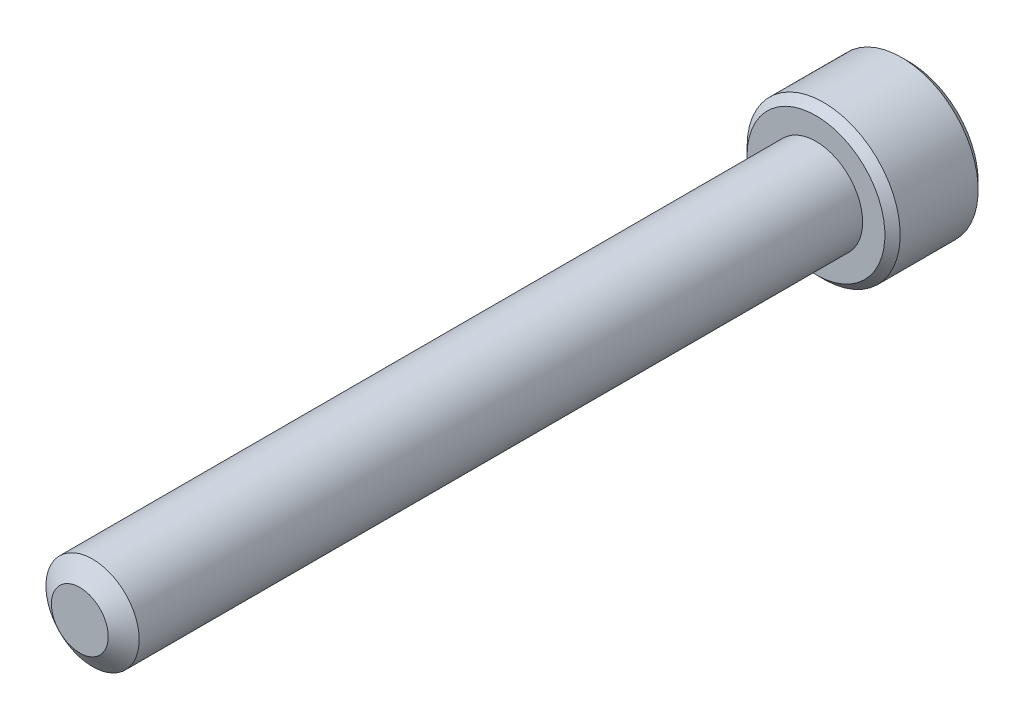
ISO-10303-21;
HEADER;
FILE_DESCRIPTION(('STEP AP214'),'2;1');
FILE_NAME('part.step','',(''),(''),'','','');
FILE_SCHEMA(('AUTOMOTIVE_DESIGN { 1 0 10303 214 1 1 1 1 }'));
ENDSEC;
DATA;
#1=APPLICATION_CONTEXT('core data for automotive mechanical design processes');
#2=APPLICATION_PROTOCOL_DEFINITION('international standard','automotive_design',2000,#1);
#3=PRODUCT_CONTEXT('',#1,'mechanical');
#4=PRODUCT('Part','Part','',(#3));
#5=PRODUCT_RELATED_PRODUCT_CATEGORY('part','',(#4));
#6=PRODUCT_DEFINITION_FORMATION('','',#4);
#7=PRODUCT_DEFINITION_CONTEXT('part definition',#1,'design');
#8=PRODUCT_DEFINITION('design','',#6,#7);
#9=PRODUCT_DEFINITION_SHAPE('','',#8);
#10=(LENGTH_UNIT() NAMED_UNIT(*) SI_UNIT(.MILLI.,.METRE.));
#11=(NAMED_UNIT(*) PLANE_ANGLE_UNIT() SI_UNIT($,.RADIAN.));
#12=(NAMED_UNIT(*) SI_UNIT($,.STERADIAN.) SOLID_ANGLE_UNIT());
#13=UNCERTAINTY_MEASURE_WITH_UNIT(LENGTH_MEASURE(1.E-05),#10,'distance_accuracy_value','');
#14=(GEOMETRIC_REPRESENTATION_CONTEXT(3) GLOBAL_UNCERTAINTY_ASSIGNED_CONTEXT((#13)) GLOBAL_UNIT_ASSIGNED_CONTEXT((#10,
#11,#12)) REPRESENTATION_CONTEXT('',''));
#15=CARTESIAN_POINT('',(0.,0.,0.));
#16=DIRECTION('',(0.,0.,1.));
#17=DIRECTION('',(1.,0.,0.));
#18=AXIS2_PLACEMENT_3D('',#15,#16,#17);
#19=CARTESIAN_POINT('',(0.,0.,-38.1));
#20=DIRECTION('',(0.,0.,1.));
#21=DIRECTION('',(1.,0.,0.));
#22=AXIS2_PLACEMENT_3D('',#19,#20,#21);
#23=CYLINDRICAL_SURFACE('',#22,2.413);
#24=CARTESIAN_POINT('',(0.,0.,-38.1));
#25=DIRECTION('',(0.,0.,-1.));
#26=DIRECTION('',(-1.,0.,0.));
#27=AXIS2_PLACEMENT_3D('',#24,#25,#26);
#28=CIRCLE('',#27,2.413);
#29=CARTESIAN_POINT('',(2.413,0.,-38.1));
#30=VERTEX_POINT('',#29);
#31=EDGE_CURVE('E216',#30,#30,#28,.F.);
#32=CARTESIAN_POINT('',(0.,0.,-0.659180743038974));
#33=DIRECTION('',(0.,0.,1.));
#34=DIRECTION('',(1.,0.,0.));
#35=AXIS2_PLACEMENT_3D('',#32,#33,#34);
#36=CIRCLE('',#35,2.413);
#37=CARTESIAN_POINT('',(2.413,0.,-0.659180743038973));
#38=VERTEX_POINT('',#37);
#39=EDGE_CURVE('E110',#38,#38,#36,.T.);
#40=CARTESIAN_POINT('',(2.413,0.,-38.1));
#41=CARTESIAN_POINT('',(2.413,0.,-37.7099914660733));
#42=CARTESIAN_POINT('',(2.413,0.,-37.3199829321466));
#43=CARTESIAN_POINT('',(2.413,0.,-36.5399658642933));
#44=CARTESIAN_POINT('',(2.413,0.,-36.1499573303666));
#45=CARTESIAN_POINT('',(2.413,0.,-35.3699402625133));
#46=CARTESIAN_POINT('',(2.413,0.,-34.9799317285866));
#47=CARTESIAN_POINT('',(2.413,0.,-34.1999146607332));
#48=CARTESIAN_POINT('',(2.413,0.,-33.8099061268066));
#49=CARTESIAN_POINT('',(2.413,0.,-33.0298890589532));
#50=CARTESIAN_POINT('',(2.413,0.,-32.6398805250265));
#51=CARTESIAN_POINT('',(2.413,0.,-31.8598634571732));
#52=CARTESIAN_POINT('',(2.413,0.,-31.4698549232465));
#53=CARTESIAN_POINT('',(2.413,0.,-30.6898378553931));
#54=CARTESIAN_POINT('',(2.413,0.,-30.2998293214665));
#55=CARTESIAN_POINT('',(2.413,0.,-29.5198122536131));
#56=CARTESIAN_POINT('',(2.413,0.,-29.1298037196864));
#57=CARTESIAN_POINT('',(2.413,0.,-28.3497866518331));
#58=CARTESIAN_POINT('',(2.413,0.,-27.9597781179064));
#59=CARTESIAN_POINT('',(2.413,0.,-27.179761050053));
#60=CARTESIAN_POINT('',(2.413,0.,-26.7897525161264));
#61=CARTESIAN_POINT('',(2.413,0.,-26.009735448273));
#62=CARTESIAN_POINT('',(2.413,0.,-25.6197269143463));
#63=CARTESIAN_POINT('',(2.413,0.,-24.839709846493));
#64=CARTESIAN_POINT('',(2.413,0.,-24.4497013125663));
#65=CARTESIAN_POINT('',(2.413,0.,-23.6696842447129));
#66=CARTESIAN_POINT('',(2.413,0.,-23.2796757107863));
#67=CARTESIAN_POINT('',(2.413,0.,-22.4996586429329));
#68=CARTESIAN_POINT('',(2.413,0.,-22.1096501090062));
#69=CARTESIAN_POINT('',(2.413,0.,-21.3296330411529));
#70=CARTESIAN_POINT('',(2.413,0.,-20.9396245072262));
#71=CARTESIAN_POINT('',(2.413,0.,-20.1596074393728));
#72=CARTESIAN_POINT('',(2.413,0.,-19.7695989054462));
#73=CARTESIAN_POINT('',(2.413,0.,-18.9895818375928));
#74=CARTESIAN_POINT('',(2.413,0.,-18.5995733036661));
#75=CARTESIAN_POINT('',(2.413,0.,-17.8195562358128));
#76=CARTESIAN_POINT('',(2.413,0.,-17.4295477018861));
#77=CARTESIAN_POINT('',(2.413,0.,-16.6495306340327));
#78=CARTESIAN_POINT('',(2.413,0.,-16.2595221001061));
#79=CARTESIAN_POINT('',(2.413,0.,-15.4795050322527));
#80=CARTESIAN_POINT('',(2.413,0.,-15.089496498326));
#81=CARTESIAN_POINT('',(2.413,0.,-14.3094794304727));
#82=CARTESIAN_POINT('',(2.413,0.,-13.919470896546));
#83=CARTESIAN_POINT('',(2.413,0.,-13.1394538286927));
#84=CARTESIAN_POINT('',(2.413,0.,-12.749445294766));
#85=CARTESIAN_POINT('',(2.413,0.,-11.9694282269126));
#86=CARTESIAN_POINT('',(2.413,0.,-11.5794196929859));
#87=CARTESIAN_POINT('',(2.413,0.,-10.7994026251326));
#88=CARTESIAN_POINT('',(2.413,0.,-10.4093940912059));
#89=CARTESIAN_POINT('',(2.413,0.,-9.62937702335255));
#90=CARTESIAN_POINT('',(2.413,0.,-9.23936848942587));
#91=CARTESIAN_POINT('',(2.413,0.,-8.45935142157252));
#92=CARTESIAN_POINT('',(2.413,0.,-8.06934288764584));
#93=CARTESIAN_POINT('',(2.413,0.,-7.28932581979249));
#94=CARTESIAN_POINT('',(2.413,0.,-6.89931728586581));
#95=CARTESIAN_POINT('',(2.413,0.,-6.11930021801246));
#96=CARTESIAN_POINT('',(2.413,0.,-5.72929168408578));
#97=CARTESIAN_POINT('',(2.413,0.,-4.94927461623242));
#98=CARTESIAN_POINT('',(2.413,0.,-4.55926608230574));
#99=CARTESIAN_POINT('',(2.413,0.,-3.77924901445239));
#100=CARTESIAN_POINT('',(2.413,0.,-3.38924048052572));
#101=CARTESIAN_POINT('',(2.413,0.,-2.60922341267236));
#102=CARTESIAN_POINT('',(2.413,0.,-2.21921487874568));
#103=CARTESIAN_POINT('',(2.413,0.,-1.43919781089233));
#104=CARTESIAN_POINT('',(2.413,0.,-1.04918927696565));
#105=CARTESIAN_POINT('',(2.413,0.,-0.659180743038973));
#106=B_SPLINE_CURVE_WITH_KNOTS('',3,(#40,#41,#42,#43,#44,#45,#46,#47,#48,#49,#50,#51,#52,#53,
#54,#55,#56,#57,#58,#59,#60,#61,#62,#63,#64,#65,#66,#67,#68,#69,#70,#71,#72,#73,#74,#75,#76,#77,
#78,#79,#80,#81,#82,#83,#84,#85,#86,#87,#88,#89,#90,#91,#92,#93,#94,#95,#96,#97,#98,#99,#100,
#101,#102,#103,#104,#105),.UNSPECIFIED.,.F.,.F.,(4,2,2,2,2,2,2,2,2,2,2,2,2,2,2,2,2,2,2,2,2,2,2,
2,2,2,2,2,2,2,2,2,4),(0.,1.17002560178003,2.34005120356006,3.51007680534009,4.68010240712012,
5.85012800890015,7.02015361068019,8.19017921246022,9.36020481424025,10.5302304160203,
11.7002560178003,12.8702816195803,14.0403072213604,15.2103328231404,16.3803584249204,
17.5503840267005,18.7204096284805,19.8904352302605,21.0604608320406,22.2304864338206,
23.4005120356006,24.5705376373807,25.7405632391607,26.9105888409407,28.0806144427208,
29.2506400445008,30.4206656462808,31.5906912480609,32.7607168498409,33.9307424516209,
35.100768053401,36.270793655181,37.440819256961),.UNSPECIFIED.);
#107=EDGE_CURVE('BSEAM36',#30,#38,#106,.T.);
#108=ORIENTED_EDGE('',*,*,#31,.T.);
#109=ORIENTED_EDGE('',*,*,#39,.F.);
#110=ORIENTED_EDGE('',*,*,#107,.T.);
#111=ORIENTED_EDGE('',*,*,#107,.F.);
#112=EDGE_LOOP('',(#108,#110,#109,#111));
#113=FACE_BOUND('',#112,.T.);
#114=ADVANCED_FACE('F36',(#113),#23,.T.);
#115=CARTESIAN_POINT('',(0.,0.,0.));
#116=DIRECTION('',(0.,0.,-1.));
#117=DIRECTION('',(-1.,0.,0.));
#118=AXIS2_PLACEMENT_3D('',#115,#116,#117);
#119=CONICAL_SURFACE('',#118,1.4715923357461,0.959931088596884);
#120=ORIENTED_EDGE('',*,*,#39,.T.);
#121=EDGE_LOOP('',(#120));
#122=FACE_BOUND('',#121,.T.);
#123=CARTESIAN_POINT('',(0.,0.,0.));
#124=DIRECTION('',(0.,0.,1.));
#125=DIRECTION('',(1.,0.,0.));
#126=AXIS2_PLACEMENT_3D('',#123,#124,#125);
#127=CIRCLE('',#126,1.4715923357461);
#128=CARTESIAN_POINT('',(1.4715923357461,0.,0.));
#129=VERTEX_POINT('',#128);
#130=EDGE_CURVE('E214',#129,#129,#127,.T.);
#131=ORIENTED_EDGE('',*,*,#130,.F.);
#132=EDGE_LOOP('',(#131));
#133=FACE_BOUND('',#132,.T.);
#134=ADVANCED_FACE('F197',(#122,#133),#119,.T.);
#135=CARTESIAN_POINT('',(0.,0.,0.));
#136=DIRECTION('',(0.,0.,1.));
#137=DIRECTION('',(1.,0.,0.));
#138=AXIS2_PLACEMENT_3D('',#135,#136,#137);
#139=PLANE('',#138);
#140=ORIENTED_EDGE('',*,*,#130,.T.);
#141=EDGE_LOOP('',(#140));
#142=FACE_BOUND('',#141,.T.);
#143=ADVANCED_FACE('F194',(#142),#139,.T.);
#144=CARTESIAN_POINT('',(0.,0.,-42.926));
#145=DIRECTION('',(0.,0.,1.));
#146=DIRECTION('',(1.,0.,0.));
#147=AXIS2_PLACEMENT_3D('',#144,#145,#146);
#148=CYLINDRICAL_SURFACE('',#147,3.9624);
#149=CARTESIAN_POINT('',(0.,0.,-42.52976));
#150=DIRECTION('',(0.,0.,-1.));
#151=DIRECTION('',(-1.,0.,0.));
#152=AXIS2_PLACEMENT_3D('',#149,#150,#151);
#153=CIRCLE('',#152,3.9624);
#154=CARTESIAN_POINT('',(-3.9624,0.,-42.52976));
#155=VERTEX_POINT('',#154);
#156=EDGE_CURVE('E44',#155,#155,#153,.F.);
#157=ORIENTED_EDGE('',*,*,#156,.T.);
#158=EDGE_LOOP('',(#157));
#159=FACE_BOUND('',#158,.T.);
#160=CARTESIAN_POINT('',(0.,0.,-38.49624));
#161=DIRECTION('',(0.,0.,-1.));
#162=DIRECTION('',(-1.,0.,0.));
#163=AXIS2_PLACEMENT_3D('',#160,#161,#162);
#164=CIRCLE('',#163,3.9624);
#165=CARTESIAN_POINT('',(-3.9624,0.,-38.49624));
#166=VERTEX_POINT('',#165);
#167=EDGE_CURVE('E173',#166,#166,#164,.T.);
#168=ORIENTED_EDGE('',*,*,#167,.T.);
#169=EDGE_LOOP('',(#168));
#170=FACE_BOUND('',#169,.T.);
#171=ADVANCED_FACE('F178',(#159,#170),#148,.T.);
#172=CARTESIAN_POINT('',(0.,0.,-42.926));
#173=DIRECTION('',(0.,0.,-1.));
#174=DIRECTION('',(-1.,0.,0.));
#175=AXIS2_PLACEMENT_3D('',#172,#173,#174);
#176=PLANE('',#175);
#177=CARTESIAN_POINT('',(0.,0.,-42.926));
#178=DIRECTION('',(0.,0.,-1.));
#179=DIRECTION('',(-1.,0.,0.));
#180=AXIS2_PLACEMENT_3D('',#177,#178,#179);
#181=CIRCLE('',#180,3.56616000000001);
#182=CARTESIAN_POINT('',(-3.56616000000001,0.,-42.926));
#183=VERTEX_POINT('',#182);
#184=EDGE_CURVE('E109',#183,#183,#181,.T.);
#185=ORIENTED_EDGE('',*,*,#184,.T.);
#186=EDGE_LOOP('',(#185));
#187=FACE_BOUND('',#186,.T.);
#188=CARTESIAN_POINT('',(0.,0.,-42.926));
#189=DIRECTION('',(0.,0.,-1.));
#190=DIRECTION('',(-1.,0.,0.));
#191=AXIS2_PLACEMENT_3D('',#188,#189,#190);
#192=CIRCLE('',#191,2.29135888084633);
#193=CARTESIAN_POINT('',(-1.984375,1.14567944042316,-42.926));
#194=VERTEX_POINT('',#193);
#195=CARTESIAN_POINT('',(0.,2.29135888084633,-42.926));
#196=VERTEX_POINT('',#195);
#197=EDGE_CURVE('E90',#194,#196,#192,.T.);
#198=ORIENTED_EDGE('',*,*,#197,.F.);
#199=CARTESIAN_POINT('',(-1.984375,-1.14567944042316,-42.926));
#200=VERTEX_POINT('',#199);
#201=EDGE_CURVE('E50',#200,#194,#192,.T.);
#202=ORIENTED_EDGE('',*,*,#201,.F.);
#203=CARTESIAN_POINT('',(0.,-2.29135888084633,-42.926));
#204=VERTEX_POINT('',#203);
#205=EDGE_CURVE('E275',#204,#200,#192,.T.);
#206=ORIENTED_EDGE('',*,*,#205,.F.);
#207=CARTESIAN_POINT('',(1.984375,-1.14567944042316,-42.926));
#208=VERTEX_POINT('',#207);
#209=EDGE_CURVE('E57',#208,#204,#192,.T.);
#210=ORIENTED_EDGE('',*,*,#209,.F.);
#211=CARTESIAN_POINT('',(1.984375,1.14567944042316,-42.926));
#212=VERTEX_POINT('',#211);
#213=EDGE_CURVE('E131',#212,#208,#192,.T.);
#214=ORIENTED_EDGE('',*,*,#213,.F.);
#215=EDGE_CURVE('E99',#196,#212,#192,.T.);
#216=ORIENTED_EDGE('',*,*,#215,.F.);
#217=EDGE_LOOP('',(#198,#202,#206,#210,#214,#216));
#218=FACE_BOUND('',#217,.T.);
#219=ADVANCED_FACE('F130',(#187,#218),#176,.T.);
#220=CARTESIAN_POINT('',(0.,0.,-38.1));
#221=DIRECTION('',(0.,0.,-1.));
#222=DIRECTION('',(-1.,0.,0.));
#223=AXIS2_PLACEMENT_3D('',#220,#221,#222);
#224=PLANE('',#223);
#225=CARTESIAN_POINT('',(0.,0.,-38.1));
#226=DIRECTION('',(0.,0.,-1.));
#227=DIRECTION('',(-1.,0.,0.));
#228=AXIS2_PLACEMENT_3D('',#225,#226,#227);
#229=CIRCLE('',#228,3.56616);
#230=CARTESIAN_POINT('',(-3.56616,0.,-38.1));
#231=VERTEX_POINT('',#230);
#232=EDGE_CURVE('E11',#231,#231,#229,.F.);
#233=ORIENTED_EDGE('',*,*,#232,.T.);
#234=EDGE_LOOP('',(#233));
#235=FACE_BOUND('',#234,.T.);
#236=ORIENTED_EDGE('',*,*,#31,.F.);
#237=EDGE_LOOP('',(#236));
#238=FACE_BOUND('',#237,.T.);
#239=ADVANCED_FACE('F187',(#235,#238),#224,.F.);
#240=CARTESIAN_POINT('',(0.,0.,-42.926));
#241=DIRECTION('',(0.,0.,-1.));
#242=DIRECTION('',(-1.,0.,0.));
#243=AXIS2_PLACEMENT_3D('',#240,#241,#242);
#244=CONICAL_SURFACE('',#243,2.29135888084633,0.78539816339745);
#245=ORIENTED_EDGE('',*,*,#215,.T.);
#246=CARTESIAN_POINT('',(-0.000199999999999152,2.29147435090016,-42.9261154787818));
#247=CARTESIAN_POINT('',(0.0680159951668034,2.25208982772757,-42.8867628522639));
#248=CARTESIAN_POINT('',(0.137372685106968,2.21204672412052,-42.8497213104462));
#249=CARTESIAN_POINT('',(0.27879880045219,2.13039431835551,-42.7818988584233));
#250=CARTESIAN_POINT('',(0.350881678736784,2.08877724917394,-42.7511556890917));
#251=CARTESIAN_POINT('',(0.496233397266005,2.00485839535392,-42.6984918888112));
#252=CARTESIAN_POINT('',(0.56946521248694,1.96257798712286,-42.67643887588));
#253=CARTESIAN_POINT('',(0.717541182594709,1.87708628592063,-42.6424614929439));
#254=CARTESIAN_POINT('',(0.792380812753429,1.83387760530244,-42.6305117560917));
#255=CARTESIAN_POINT('',(0.921360414543821,1.75941119748879,-42.6197300990819));
#256=CARTESIAN_POINT('',(0.975333715772448,1.72824969749539,-42.6181338990591));
#257=CARTESIAN_POINT('',(1.08319211851981,1.66597761963484,-42.6208218388653));
#258=CARTESIAN_POINT('',(1.13707718248553,1.63486706344893,-42.6251080403405));
#259=CARTESIAN_POINT('',(1.24433853824861,1.57293969082547,-42.6393168730135));
#260=CARTESIAN_POINT('',(1.29771419276015,1.54212324232506,-42.6492458104523));
#261=CARTESIAN_POINT('',(1.4035425174089,1.48102323060121,-42.6741950842745));
#262=CARTESIAN_POINT('',(1.45599525797111,1.45073962671789,-42.6892150303895));
#263=CARTESIAN_POINT('',(1.59035733896365,1.37316564308797,-42.7338078516357));
#264=CARTESIAN_POINT('',(1.67143335715833,1.32635638215845,-42.7667429959383));
#265=CARTESIAN_POINT('',(1.79064830672984,1.25752759893191,-42.8223424412022));
#266=CARTESIAN_POINT('',(1.829934924386,1.23484545965257,-42.8418775920519));
#267=CARTESIAN_POINT('',(1.90778036186805,1.18990137536713,-42.8827287381194));
#268=CARTESIAN_POINT('',(1.9463396111017,1.16763918244233,-42.9040436395683));
#269=CARTESIAN_POINT('',(1.984575,1.14556397036933,-42.9261154787818));
#270=B_SPLINE_CURVE_WITH_KNOTS('',3,(#246,#247,#248,#249,#250,#251,#252,#253,#254,#255,#256,
#257,#258,#259,#260,#261,#262,#263,#264,#265,#266,#267,#268,#269),.UNSPECIFIED.,.F.,.F.,(4,2,2,
2,2,2,2,2,2,2,2,4),(0.,0.264339630306631,0.530219665093695,0.791876416371461,1.0528742441811,
1.23963984393201,1.42647091743853,1.61351120244035,1.80053715247541,2.09764209964316,
2.24579179873713,2.39385111134157),.UNSPECIFIED.);
#271=EDGE_CURVE('E104',#196,#212,#270,.T.);
#272=ORIENTED_EDGE('',*,*,#271,.F.);
#273=EDGE_LOOP('',(#245,#272));
#274=FACE_BOUND('',#273,.T.);
#275=ADVANCED_FACE('F105',(#274),#244,.F.);
#276=ORIENTED_EDGE('',*,*,#213,.T.);
#277=CARTESIAN_POINT('',(1.984375,-2.28495242157822,-43.6609840788166));
#278=CARTESIAN_POINT('',(1.984375,-2.22931635455401,-43.6189866855508));
#279=CARTESIAN_POINT('',(1.984375,-2.17336876548388,-43.5773960540763));
#280=CARTESIAN_POINT('',(1.984375,-2.0607277025817,-43.4952084614715));
#281=CARTESIAN_POINT('',(1.984375,-2.00403404503434,-43.454611752405));
#282=CARTESIAN_POINT('',(1.984375,-1.88936329173488,-43.3743035031747));
#283=CARTESIAN_POINT('',(1.984375,-1.83137965519347,-43.3346012588133));
#284=CARTESIAN_POINT('',(1.984375,-1.7144280213784,-43.2566851734013));
#285=CARTESIAN_POINT('',(1.984375,-1.65546009407227,-43.2184712271944));
#286=CARTESIAN_POINT('',(1.984375,-1.47005472306035,-43.1022528340136));
#287=CARTESIAN_POINT('',(1.984375,-1.34163909427883,-43.0273478868724));
#288=CARTESIAN_POINT('',(1.984375,-1.07840384705479,-42.8903302154397));
#289=CARTESIAN_POINT('',(1.984375,-0.94360778140742,-42.8281743664824));
#290=CARTESIAN_POINT('',(1.984375,-0.741275100444877,-42.7521325786886));
#291=CARTESIAN_POINT('',(1.984375,-0.67673540888109,-42.730308061326));
#292=CARTESIAN_POINT('',(1.984375,-0.546098118112757,-42.6918404635378));
#293=CARTESIAN_POINT('',(1.984375,-0.480000411919951,-42.6751977400655));
#294=CARTESIAN_POINT('',(1.984375,-0.347746170028527,-42.6482353808697));
#295=CARTESIAN_POINT('',(1.984375,-0.281612071479118,-42.6378074097359));
#296=CARTESIAN_POINT('',(1.984375,-0.148636620052344,-42.6234781473766));
#297=CARTESIAN_POINT('',(1.984375,-0.0817953907393173,-42.6195757342274));
#298=CARTESIAN_POINT('',(1.984375,0.0495156750890711,-42.6185870513327));
#299=CARTESIAN_POINT('',(1.984375,0.113983775102998,-42.621259178875));
#300=CARTESIAN_POINT('',(1.984375,0.242367515846183,-42.6327392104975));
#301=CARTESIAN_POINT('',(1.984375,0.306283102295926,-42.6415477106392));
#302=CARTESIAN_POINT('',(1.984375,0.434181040262191,-42.6649690213329));
#303=CARTESIAN_POINT('',(1.984375,0.498145026858317,-42.6796806062321));
#304=CARTESIAN_POINT('',(1.984375,0.624675616953014,-42.7141261814121));
#305=CARTESIAN_POINT('',(1.984375,0.687242336899695,-42.7338597514492));
#306=CARTESIAN_POINT('',(1.984375,0.884225483826093,-42.8034122372308));
#307=CARTESIAN_POINT('',(1.984375,1.01583674256469,-42.8611524112565));
#308=CARTESIAN_POINT('',(1.984375,1.27288659242652,-42.9895303365888));
#309=CARTESIAN_POINT('',(1.984375,1.3983008827048,-43.0602144249194));
#310=CARTESIAN_POINT('',(1.984375,1.57956687990222,-43.1705166638132));
#311=CARTESIAN_POINT('',(1.984375,1.63738271299425,-43.2069698294754));
#312=CARTESIAN_POINT('',(1.984375,1.75202215386203,-43.2814159632917));
#313=CARTESIAN_POINT('',(1.984375,1.80884568601363,-43.3194090480781));
#314=CARTESIAN_POINT('',(1.984375,1.92116923084256,-43.3963388088931));
#315=CARTESIAN_POINT('',(1.984375,1.97667624512254,-43.4352653130388));
#316=CARTESIAN_POINT('',(1.984375,2.08693170717168,-43.5141477461214));
#317=CARTESIAN_POINT('',(1.984375,2.14168035934794,-43.554103389024));
#318=CARTESIAN_POINT('',(1.984375,2.19611149046624,-43.5944806112854));
#319=B_SPLINE_CURVE_WITH_KNOTS('',3,(#277,#278,#279,#280,#281,#282,#283,#284,#285,#286,#287,
#288,#289,#290,#291,#292,#293,#294,#295,#296,#297,#298,#299,#300,#301,#302,#303,#304,#305,#306,
#307,#308,#309,#310,#311,#312,#313,#314,#315,#316,#317,#318),.UNSPECIFIED.,.F.,.F.,(4,2,2,2,2,2,
2,2,2,2,2,2,2,2,2,2,2,2,2,2,4),(0.,0.209126070008328,0.418304637356572,0.629103979977992,
0.839888401371184,1.28549951116127,1.72957750768351,1.93379389749971,2.13802435186698,
2.33858179514333,2.53910475350639,2.73236963400794,2.92565329006887,3.12231577097487,
3.31896180041345,3.74886295245172,4.18033428125363,4.3853601718029,4.59040161996383,
4.79377749165108,4.99709743524132),.UNSPECIFIED.);
#320=EDGE_CURVE('E98',#212,#208,#319,.F.);
#321=ORIENTED_EDGE('',*,*,#320,.F.);
#322=EDGE_LOOP('',(#276,#321));
#323=FACE_BOUND('',#322,.T.);
#324=ADVANCED_FACE('F281',(#323),#244,.F.);
#325=ORIENTED_EDGE('',*,*,#209,.T.);
#326=CARTESIAN_POINT('',(1.984575,-1.14556397036933,-42.9261154787818));
#327=CARTESIAN_POINT('',(1.9163590048332,-1.18494849354192,-42.8867628522639));
#328=CARTESIAN_POINT('',(1.84700231489303,-1.22499159714897,-42.8497213104462));
#329=CARTESIAN_POINT('',(1.70557619954781,-1.30664400291398,-42.7818988584233));
#330=CARTESIAN_POINT('',(1.63349332126322,-1.34826107209555,-42.7511556890917));
#331=CARTESIAN_POINT('',(1.48814160273399,-1.43217992591557,-42.6984918888112));
#332=CARTESIAN_POINT('',(1.41490978751306,-1.47446033414663,-42.67643887588));
#333=CARTESIAN_POINT('',(1.26683381740529,-1.55995203534886,-42.6424614929439));
#334=CARTESIAN_POINT('',(1.19199418724657,-1.60316071596705,-42.6305117560917));
#335=CARTESIAN_POINT('',(1.06301458545618,-1.6776271237807,-42.6197300990819));
#336=CARTESIAN_POINT('',(1.00904128422755,-1.7087886237741,-42.6181338990591));
#337=CARTESIAN_POINT('',(0.901182881480194,-1.77106070163465,-42.6208218388653));
#338=CARTESIAN_POINT('',(0.84729781751447,-1.80217125782057,-42.6251080403405));
#339=CARTESIAN_POINT('',(0.74003646175139,-1.86409863044402,-42.6393168730135));
#340=CARTESIAN_POINT('',(0.686660807239853,-1.89491507894443,-42.6492458104523));
#341=CARTESIAN_POINT('',(0.580832482591098,-1.95601509066828,-42.6741950842745));
#342=CARTESIAN_POINT('',(0.528379742028893,-1.9862986945516,-42.6892150303895));
#343=CARTESIAN_POINT('',(0.394017661036347,-2.06387267818152,-42.7338078516357));
#344=CARTESIAN_POINT('',(0.312941642841673,-2.11068193911104,-42.7667429959383));
#345=CARTESIAN_POINT('',(0.19372669327016,-2.17951072233758,-42.8223424412022));
#346=CARTESIAN_POINT('',(0.154440075613999,-2.20219286161692,-42.8418775920519));
#347=CARTESIAN_POINT('',(0.0765946381319483,-2.24713694590237,-42.8827287381194));
#348=CARTESIAN_POINT('',(0.038035388898303,-2.26939913882716,-42.9040436395683));
#349=CARTESIAN_POINT('',(-0.000199999999998087,-2.29147435090016,-42.9261154787818));
#350=B_SPLINE_CURVE_WITH_KNOTS('',3,(#326,#327,#328,#329,#330,#331,#332,#333,#334,#335,#336,
#337,#338,#339,#340,#341,#342,#343,#344,#345,#346,#347,#348,#349),.UNSPECIFIED.,.F.,.F.,(4,2,2,
2,2,2,2,2,2,2,2,4),(0.,0.264339630306631,0.530219665093695,0.791876416371461,1.0528742441811,
1.23963984393201,1.42647091743853,1.61351120244035,1.80053715247541,2.09764209964316,
2.24579179873713,2.39385111134157),.UNSPECIFIED.);
#351=EDGE_CURVE('E141',#208,#204,#350,.T.);
#352=ORIENTED_EDGE('',*,*,#351,.F.);
#353=EDGE_LOOP('',(#325,#352));
#354=FACE_BOUND('',#353,.T.);
#355=ADVANCED_FACE('F278',(#354),#244,.F.);
#356=ORIENTED_EDGE('',*,*,#205,.T.);
#357=CARTESIAN_POINT('',(0.000200000000000443,-2.29147435090016,-42.9261154787818));
#358=CARTESIAN_POINT('',(-0.0680159951668024,-2.25208982772757,-42.8867628522639));
#359=CARTESIAN_POINT('',(-0.137372685106967,-2.21204672412052,-42.8497213104462));
#360=CARTESIAN_POINT('',(-0.278798800452189,-2.13039431835551,-42.7818988584233));
#361=CARTESIAN_POINT('',(-0.350881678736784,-2.08877724917394,-42.7511556890917));
#362=CARTESIAN_POINT('',(-0.496233397266005,-2.00485839535392,-42.6984918888112));
#363=CARTESIAN_POINT('',(-0.56946521248694,-1.96257798712286,-42.67643887588));
#364=CARTESIAN_POINT('',(-0.717541182594708,-1.87708628592063,-42.6424614929439));
#365=CARTESIAN_POINT('',(-0.792380812753428,-1.83387760530244,-42.6305117560917));
#366=CARTESIAN_POINT('',(-0.92136041454382,-1.75941119748879,-42.6197300990819));
#367=CARTESIAN_POINT('',(-0.975333715772446,-1.72824969749539,-42.6181338990591));
#368=CARTESIAN_POINT('',(-1.0831921185198,-1.66597761963484,-42.6208218388653));
#369=CARTESIAN_POINT('',(-1.13707718248553,-1.63486706344893,-42.6251080403405));
#370=CARTESIAN_POINT('',(-1.24433853824861,-1.57293969082547,-42.6393168730135));
#371=CARTESIAN_POINT('',(-1.29771419276014,-1.54212324232506,-42.6492458104523));
#372=CARTESIAN_POINT('',(-1.4035425174089,-1.48102323060121,-42.6741950842745));
#373=CARTESIAN_POINT('',(-1.45599525797111,-1.45073962671789,-42.6892150303895));
#374=CARTESIAN_POINT('',(-1.59035733896365,-1.37316564308797,-42.7338078516357));
#375=CARTESIAN_POINT('',(-1.67143335715833,-1.32635638215845,-42.7667429959383));
#376=CARTESIAN_POINT('',(-1.79064830672984,-1.25752759893191,-42.8223424412022));
#377=CARTESIAN_POINT('',(-1.829934924386,-1.23484545965257,-42.8418775920519));
#378=CARTESIAN_POINT('',(-1.90778036186805,-1.18990137536713,-42.8827287381194));
#379=CARTESIAN_POINT('',(-1.9463396111017,-1.16763918244233,-42.9040436395683));
#380=CARTESIAN_POINT('',(-1.984575,-1.14556397036933,-42.9261154787818));
#381=B_SPLINE_CURVE_WITH_KNOTS('',3,(#357,#358,#359,#360,#361,#362,#363,#364,#365,#366,#367,
#368,#369,#370,#371,#372,#373,#374,#375,#376,#377,#378,#379,#380),.UNSPECIFIED.,.F.,.F.,(4,2,2,
2,2,2,2,2,2,2,2,4),(0.,0.264339630306631,0.530219665093696,0.791876416371462,1.0528742441811,
1.23963984393201,1.42647091743853,1.61351120244035,1.80053715247541,2.09764209964316,
2.24579179873713,2.39385111134157),.UNSPECIFIED.);
#382=EDGE_CURVE('E252',#204,#200,#381,.T.);
#383=ORIENTED_EDGE('',*,*,#382,.F.);
#384=EDGE_LOOP('',(#356,#383));
#385=FACE_BOUND('',#384,.T.);
#386=ADVANCED_FACE('F277',(#385),#244,.F.);
#387=ORIENTED_EDGE('',*,*,#201,.T.);
#388=CARTESIAN_POINT('',(-1.984375,-2.28495242191066,-43.6609840790676));
#389=CARTESIAN_POINT('',(-1.984375,-2.22931635487713,-43.6189866857921));
#390=CARTESIAN_POINT('',(-1.984375,-2.17336876579765,-43.577396054308));
#391=CARTESIAN_POINT('',(-1.984375,-2.06072770287666,-43.4952084616839));
#392=CARTESIAN_POINT('',(-1.984375,-2.00403404531984,-43.4546117526079));
#393=CARTESIAN_POINT('',(-1.984375,-1.88936329200116,-43.3743035033582));
#394=CARTESIAN_POINT('',(-1.984375,-1.83137965544998,-43.3346012589872));
#395=CARTESIAN_POINT('',(-1.984375,-1.71442802161518,-43.256685173556));
#396=CARTESIAN_POINT('',(-1.984375,-1.6554600942991,-43.2184712273396));
#397=CARTESIAN_POINT('',(-1.984375,-1.47005472325435,-43.1022528341287));
#398=CARTESIAN_POINT('',(-1.984375,-1.34163909444949,-43.0273478869673));
#399=CARTESIAN_POINT('',(-1.984375,-1.07840384717678,-42.8903302154972));
#400=CARTESIAN_POINT('',(-1.984375,-0.943607781504093,-42.8281743665226));
#401=CARTESIAN_POINT('',(-1.984375,-0.741275100522505,-42.752132578716));
#402=CARTESIAN_POINT('',(-1.984375,-0.676735408966693,-42.7303080613539));
#403=CARTESIAN_POINT('',(-1.984375,-0.546098118214571,-42.6918404635651));
#404=CARTESIAN_POINT('',(-1.984375,-0.480000412030002,-42.6751977400917));
#405=CARTESIAN_POINT('',(-1.984375,-0.347746170154779,-42.6482353808918));
#406=CARTESIAN_POINT('',(-1.984375,-0.28161207161333,-42.637807409755));
#407=CARTESIAN_POINT('',(-1.984375,-0.148636620202213,-42.6234781473881));
#408=CARTESIAN_POINT('',(-1.984375,-0.0817953908968814,-42.6195757342341));
#409=CARTESIAN_POINT('',(-1.984375,0.0495156749173092,-42.6185870513286));
#410=CARTESIAN_POINT('',(-1.984375,0.113983774924714,-42.621259178865));
#411=CARTESIAN_POINT('',(-1.984375,0.242367515655507,-42.6327392104746));
#412=CARTESIAN_POINT('',(-1.984375,0.306283102099381,-42.6415477106094));
#413=CARTESIAN_POINT('',(-1.984375,0.434181040054057,-42.6649690212885));
#414=CARTESIAN_POINT('',(-1.984375,0.498145026644482,-42.6796806061801));
#415=CARTESIAN_POINT('',(-1.984375,0.624675616728329,-42.7141261813447));
#416=CARTESIAN_POINT('',(-1.984375,0.687242336669861,-42.733859751374));
#417=CARTESIAN_POINT('',(-1.984375,0.884225483546216,-42.8034122371188));
#418=CARTESIAN_POINT('',(-1.984375,1.01583674224242,-42.8611524111108));
#419=CARTESIAN_POINT('',(-1.984375,1.27288659202274,-42.9895303363718));
#420=CARTESIAN_POINT('',(-1.984375,1.39830088226191,-43.0602144246649));
#421=CARTESIAN_POINT('',(-1.984375,1.57956687940504,-43.1705166635036));
#422=CARTESIAN_POINT('',(-1.984375,1.63738271248119,-43.2069698291489));
#423=CARTESIAN_POINT('',(-1.984375,1.75202215331742,-43.2814159629313));
#424=CARTESIAN_POINT('',(-1.984375,1.80884568545337,-43.3194090477007));
#425=CARTESIAN_POINT('',(-1.984375,1.92116923025137,-43.3963388084819));
#426=CARTESIAN_POINT('',(-1.984375,1.97667624451607,-43.4352653126108));
#427=CARTESIAN_POINT('',(-1.984375,2.08693170653473,-43.5141477456598));
#428=CARTESIAN_POINT('',(-1.984375,2.14168035869582,-43.5541033885457));
#429=CARTESIAN_POINT('',(-1.984375,2.19611148979896,-43.5944806107903));
#430=B_SPLINE_CURVE_WITH_KNOTS('',3,(#388,#389,#390,#391,#392,#393,#394,#395,#396,#397,#398,
#399,#400,#401,#402,#403,#404,#405,#406,#407,#408,#409,#410,#411,#412,#413,#414,#415,#416,#417,
#418,#419,#420,#421,#422,#423,#424,#425,#426,#427,#428,#429),.UNSPECIFIED.,.F.,.F.,(4,2,2,2,2,2,
2,2,2,2,2,2,2,2,2,2,2,2,2,2,4),(0.,0.209126070048126,0.418304637436187,0.629103980098177,
0.839888401531924,1.28549951141298,1.72957750802532,1.93379389781846,2.13802435216271,
2.33858179541698,2.53910475375795,2.73236963423929,2.92565329027998,3.12231577116421,
3.31896180058101,3.7488629524628,4.18033428110719,4.38536017158908,4.59040161968262,
4.79377749130339,4.99709743482716),.UNSPECIFIED.);
#431=EDGE_CURVE('E120',#200,#194,#430,.T.);
#432=ORIENTED_EDGE('',*,*,#431,.F.);
#433=EDGE_LOOP('',(#387,#432));
#434=FACE_BOUND('',#433,.T.);
#435=ADVANCED_FACE('F290',(#434),#244,.F.);
#436=ORIENTED_EDGE('',*,*,#197,.T.);
#437=CARTESIAN_POINT('',(-1.984575,1.14556397036933,-42.9261154787818));
#438=CARTESIAN_POINT('',(-1.9163590048332,1.18494849354192,-42.8867628522639));
#439=CARTESIAN_POINT('',(-1.84700231489303,1.22499159714897,-42.8497213104462));
#440=CARTESIAN_POINT('',(-1.70557619954781,1.30664400291398,-42.7818988584233));
#441=CARTESIAN_POINT('',(-1.63349332126321,1.34826107209555,-42.7511556890917));
#442=CARTESIAN_POINT('',(-1.48814160273399,1.43217992591558,-42.6984918888112));
#443=CARTESIAN_POINT('',(-1.41490978751306,1.47446033414663,-42.67643887588));
#444=CARTESIAN_POINT('',(-1.26683381740529,1.55995203534886,-42.6424614929439));
#445=CARTESIAN_POINT('',(-1.19199418724657,1.60316071596705,-42.6305117560917));
#446=CARTESIAN_POINT('',(-1.06301458545618,1.6776271237807,-42.6197300990819));
#447=CARTESIAN_POINT('',(-1.00904128422755,1.7087886237741,-42.6181338990591));
#448=CARTESIAN_POINT('',(-0.901182881480194,1.77106070163465,-42.6208218388653));
#449=CARTESIAN_POINT('',(-0.847297817514471,1.80217125782056,-42.6251080403405));
#450=CARTESIAN_POINT('',(-0.740036461751391,1.86409863044402,-42.6393168730135));
#451=CARTESIAN_POINT('',(-0.686660807239854,1.89491507894443,-42.6492458104523));
#452=CARTESIAN_POINT('',(-0.580832482591098,1.95601509066828,-42.6741950842745));
#453=CARTESIAN_POINT('',(-0.528379742028894,1.9862986945516,-42.6892150303895));
#454=CARTESIAN_POINT('',(-0.394017661036347,2.06387267818152,-42.7338078516357));
#455=CARTESIAN_POINT('',(-0.312941642841672,2.11068193911104,-42.7667429959383));
#456=CARTESIAN_POINT('',(-0.193726693270159,2.17951072233758,-42.8223424412022));
#457=CARTESIAN_POINT('',(-0.154440075613998,2.20219286161692,-42.8418775920519));
#458=CARTESIAN_POINT('',(-0.0765946381319469,2.24713694590237,-42.8827287381194));
#459=CARTESIAN_POINT('',(-0.0380353888983016,2.26939913882716,-42.9040436395683));
#460=CARTESIAN_POINT('',(0.000199999999999549,2.29147435090016,-42.9261154787818));
#461=B_SPLINE_CURVE_WITH_KNOTS('',3,(#437,#438,#439,#440,#441,#442,#443,#444,#445,#446,#447,
#448,#449,#450,#451,#452,#453,#454,#455,#456,#457,#458,#459,#460),.UNSPECIFIED.,.F.,.F.,(4,2,2,
2,2,2,2,2,2,2,2,4),(0.,0.264339630306632,0.530219665093698,0.791876416371465,1.0528742441811,
1.23963984393201,1.42647091743853,1.61351120244035,1.80053715247541,2.09764209964316,
2.24579179873714,2.39385111134157),.UNSPECIFIED.);
#462=EDGE_CURVE('E94',#194,#196,#461,.T.);
#463=ORIENTED_EDGE('',*,*,#462,.F.);
#464=EDGE_LOOP('',(#436,#463));
#465=FACE_BOUND('',#464,.T.);
#466=ADVANCED_FACE('F92',(#465),#244,.F.);
#467=CARTESIAN_POINT('',(1.984375,3.43703832126949,-39.9494375));
#468=DIRECTION('',(0.,0.,-1.));
#469=DIRECTION('',(-1.,0.,0.));
#470=AXIS2_PLACEMENT_3D('',#467,#468,#469);
#471=PLANE('',#470);
#472=DIRECTION('',(0.866025403784439,0.5,0.));
#473=VECTOR('',#472,1.);
#474=CARTESIAN_POINT('',(-1.984375,1.14567944042316,-39.9494375));
#475=LINE('',#474,#473);
#476=CARTESIAN_POINT('',(-1.984375,1.14567944042316,-39.9494375));
#477=VERTEX_POINT('',#476);
#478=CARTESIAN_POINT('',(0.,2.29135888084633,-39.9494375));
#479=VERTEX_POINT('',#478);
#480=EDGE_CURVE('E119',#477,#479,#475,.T.);
#481=ORIENTED_EDGE('',*,*,#480,.T.);
#482=DIRECTION('',(0.866025403784439,-0.5,0.));
#483=VECTOR('',#482,1.);
#484=CARTESIAN_POINT('',(0.,2.29135888084633,-39.9494375));
#485=LINE('',#484,#483);
#486=CARTESIAN_POINT('',(1.984375,1.14567944042316,-39.9494375));
#487=VERTEX_POINT('',#486);
#488=EDGE_CURVE('E124',#479,#487,#485,.T.);
#489=ORIENTED_EDGE('',*,*,#488,.T.);
#490=DIRECTION('',(0.,-1.,0.));
#491=VECTOR('',#490,1.);
#492=CARTESIAN_POINT('',(1.984375,1.14567944042316,-39.9494375));
#493=LINE('',#492,#491);
#494=CARTESIAN_POINT('',(1.984375,-1.14567944042316,-39.9494375));
#495=VERTEX_POINT('',#494);
#496=EDGE_CURVE('E238',#487,#495,#493,.T.);
#497=ORIENTED_EDGE('',*,*,#496,.T.);
#498=DIRECTION('',(-0.866025403784439,-0.5,0.));
#499=VECTOR('',#498,1.);
#500=CARTESIAN_POINT('',(1.984375,-1.14567944042316,-39.9494375));
#501=LINE('',#500,#499);
#502=CARTESIAN_POINT('',(0.,-2.29135888084633,-39.9494375));
#503=VERTEX_POINT('',#502);
#504=EDGE_CURVE('E235',#495,#503,#501,.T.);
#505=ORIENTED_EDGE('',*,*,#504,.T.);
#506=DIRECTION('',(-0.866025403784439,0.5,0.));
#507=VECTOR('',#506,1.);
#508=CARTESIAN_POINT('',(0.,-2.29135888084633,-39.9494375));
#509=LINE('',#508,#507);
#510=CARTESIAN_POINT('',(-1.984375,-1.14567944042316,-39.9494375));
#511=VERTEX_POINT('',#510);
#512=EDGE_CURVE('E232',#503,#511,#509,.T.);
#513=ORIENTED_EDGE('',*,*,#512,.T.);
#514=DIRECTION('',(0.,1.,0.));
#515=VECTOR('',#514,1.);
#516=CARTESIAN_POINT('',(-1.984375,-1.14567944042316,-39.9494375));
#517=LINE('',#516,#515);
#518=EDGE_CURVE('E127',#511,#477,#517,.T.);
#519=ORIENTED_EDGE('',*,*,#518,.T.);
#520=EDGE_LOOP('',(#481,#489,#497,#505,#513,#519));
#521=FACE_BOUND('',#520,.T.);
#522=ADVANCED_FACE('F161',(#521),#471,.T.);
#523=CARTESIAN_POINT('',(0.,2.29135888084633,-39.9494375));
#524=DIRECTION('',(0.5,0.866025403784439,0.));
#525=DIRECTION('',(-0.866025403784439,0.5,0.));
#526=AXIS2_PLACEMENT_3D('',#523,#524,#525);
#527=PLANE('',#526);
#528=DIRECTION('',(0.,0.,-1.));
#529=VECTOR('',#528,1.);
#530=CARTESIAN_POINT('',(0.,2.29135888084633,-39.9494375));
#531=LINE('',#530,#529);
#532=EDGE_CURVE('E116',#479,#196,#531,.T.);
#533=ORIENTED_EDGE('',*,*,#532,.T.);
#534=ORIENTED_EDGE('',*,*,#271,.T.);
#535=DIRECTION('',(0.,0.,-1.));
#536=VECTOR('',#535,1.);
#537=CARTESIAN_POINT('',(1.984375,1.14567944042316,-39.9494375));
#538=LINE('',#537,#536);
#539=EDGE_CURVE('E126',#487,#212,#538,.T.);
#540=ORIENTED_EDGE('',*,*,#539,.F.);
#541=ORIENTED_EDGE('',*,*,#488,.F.);
#542=EDGE_LOOP('',(#533,#534,#540,#541));
#543=FACE_BOUND('',#542,.T.);
#544=ADVANCED_FACE('F122',(#543),#527,.F.);
#545=CARTESIAN_POINT('',(1.984375,1.14567944042316,-39.9494375));
#546=DIRECTION('',(1.,0.,0.));
#547=DIRECTION('',(0.,0.,-1.));
#548=AXIS2_PLACEMENT_3D('',#545,#546,#547);
#549=PLANE('',#548);
#550=ORIENTED_EDGE('',*,*,#539,.T.);
#551=ORIENTED_EDGE('',*,*,#320,.T.);
#552=DIRECTION('',(0.,0.,-1.));
#553=VECTOR('',#552,1.);
#554=CARTESIAN_POINT('',(1.984375,-1.14567944042316,-39.9494375));
#555=LINE('',#554,#553);
#556=EDGE_CURVE('E221',#495,#208,#555,.T.);
#557=ORIENTED_EDGE('',*,*,#556,.F.);
#558=ORIENTED_EDGE('',*,*,#496,.F.);
#559=EDGE_LOOP('',(#550,#551,#557,#558));
#560=FACE_BOUND('',#559,.T.);
#561=ADVANCED_FACE('F150',(#560),#549,.F.);
#562=CARTESIAN_POINT('',(1.984375,-1.14567944042316,-39.9494375));
#563=DIRECTION('',(0.5,-0.866025403784439,0.));
#564=DIRECTION('',(0.866025403784439,0.5,0.));
#565=AXIS2_PLACEMENT_3D('',#562,#563,#564);
#566=PLANE('',#565);
#567=ORIENTED_EDGE('',*,*,#556,.T.);
#568=ORIENTED_EDGE('',*,*,#351,.T.);
#569=DIRECTION('',(0.,0.,-1.));
#570=VECTOR('',#569,1.);
#571=CARTESIAN_POINT('',(0.,-2.29135888084633,-39.9494375));
#572=LINE('',#571,#570);
#573=EDGE_CURVE('E224',#503,#204,#572,.T.);
#574=ORIENTED_EDGE('',*,*,#573,.F.);
#575=ORIENTED_EDGE('',*,*,#504,.F.);
#576=EDGE_LOOP('',(#567,#568,#574,#575));
#577=FACE_BOUND('',#576,.T.);
#578=ADVANCED_FACE('F154',(#577),#566,.F.);
#579=CARTESIAN_POINT('',(0.,-2.29135888084633,-39.9494375));
#580=DIRECTION('',(-0.5,-0.866025403784439,0.));
#581=DIRECTION('',(0.866025403784439,-0.5,0.));
#582=AXIS2_PLACEMENT_3D('',#579,#580,#581);
#583=PLANE('',#582);
#584=ORIENTED_EDGE('',*,*,#573,.T.);
#585=ORIENTED_EDGE('',*,*,#382,.T.);
#586=DIRECTION('',(0.,0.,-1.));
#587=VECTOR('',#586,1.);
#588=CARTESIAN_POINT('',(-1.984375,-1.14567944042316,-39.9494375));
#589=LINE('',#588,#587);
#590=EDGE_CURVE('E227',#511,#200,#589,.T.);
#591=ORIENTED_EDGE('',*,*,#590,.F.);
#592=ORIENTED_EDGE('',*,*,#512,.F.);
#593=EDGE_LOOP('',(#584,#585,#591,#592));
#594=FACE_BOUND('',#593,.T.);
#595=ADVANCED_FACE('F260',(#594),#583,.F.);
#596=CARTESIAN_POINT('',(-1.984375,-1.14567944042316,-39.9494375));
#597=DIRECTION('',(-1.,0.,0.));
#598=DIRECTION('',(0.,-1.,0.));
#599=AXIS2_PLACEMENT_3D('',#596,#597,#598);
#600=PLANE('',#599);
#601=ORIENTED_EDGE('',*,*,#590,.T.);
#602=ORIENTED_EDGE('',*,*,#431,.T.);
#603=DIRECTION('',(0.,0.,-1.));
#604=VECTOR('',#603,1.);
#605=CARTESIAN_POINT('',(-1.984375,1.14567944042316,-39.9494375));
#606=LINE('',#605,#604);
#607=EDGE_CURVE('E118',#477,#194,#606,.T.);
#608=ORIENTED_EDGE('',*,*,#607,.F.);
#609=ORIENTED_EDGE('',*,*,#518,.F.);
#610=EDGE_LOOP('',(#601,#602,#608,#609));
#611=FACE_BOUND('',#610,.T.);
#612=ADVANCED_FACE('F257',(#611),#600,.F.);
#613=CARTESIAN_POINT('',(-1.984375,1.14567944042316,-39.9494375));
#614=DIRECTION('',(-0.5,0.866025403784439,0.));
#615=DIRECTION('',(-0.866025403784439,-0.5,0.));
#616=AXIS2_PLACEMENT_3D('',#613,#614,#615);
#617=PLANE('',#616);
#618=ORIENTED_EDGE('',*,*,#607,.T.);
#619=ORIENTED_EDGE('',*,*,#462,.T.);
#620=ORIENTED_EDGE('',*,*,#532,.F.);
#621=ORIENTED_EDGE('',*,*,#480,.F.);
#622=EDGE_LOOP('',(#618,#619,#620,#621));
#623=FACE_BOUND('',#622,.T.);
#624=ADVANCED_FACE('F114',(#623),#617,.F.);
#625=CARTESIAN_POINT('',(0.,0.,-42.926));
#626=DIRECTION('',(0.,0.,1.));
#627=DIRECTION('',(1.,0.,0.));
#628=AXIS2_PLACEMENT_3D('',#625,#626,#627);
#629=CONICAL_SURFACE('',#628,3.56616000000001,0.785398163397442);
#630=ORIENTED_EDGE('',*,*,#156,.F.);
#631=EDGE_LOOP('',(#630));
#632=FACE_BOUND('',#631,.T.);
#633=ORIENTED_EDGE('',*,*,#184,.F.);
#634=EDGE_LOOP('',(#633));
#635=FACE_BOUND('',#634,.T.);
#636=ADVANCED_FACE('F181',(#632,#635),#629,.T.);
#637=CARTESIAN_POINT('',(0.,0.,-38.49624));
#638=DIRECTION('',(0.,0.,-1.));
#639=DIRECTION('',(-1.,0.,0.));
#640=AXIS2_PLACEMENT_3D('',#637,#638,#639);
#641=CONICAL_SURFACE('',#640,3.9624,0.785398163397442);
#642=ORIENTED_EDGE('',*,*,#232,.F.);
#643=EDGE_LOOP('',(#642));
#644=FACE_BOUND('',#643,.T.);
#645=ORIENTED_EDGE('',*,*,#167,.F.);
#646=EDGE_LOOP('',(#645));
#647=FACE_BOUND('',#646,.T.);
#648=ADVANCED_FACE('F38',(#644,#647),#641,.T.);
#649=CLOSED_SHELL('',(#114,#134,#143,#171,#219,#239,#275,#324,#355,#386,#435,#466,#522,#544,
#561,#578,#595,#612,#624,#636,#648));
#650=MANIFOLD_SOLID_BREP('B2',#649);
#651=ADVANCED_BREP_SHAPE_REPRESENTATION('',(#18,#650),#14);
#652=SHAPE_DEFINITION_REPRESENTATION(#9,#651);
ENDSEC;
END-ISO-10303-21;
